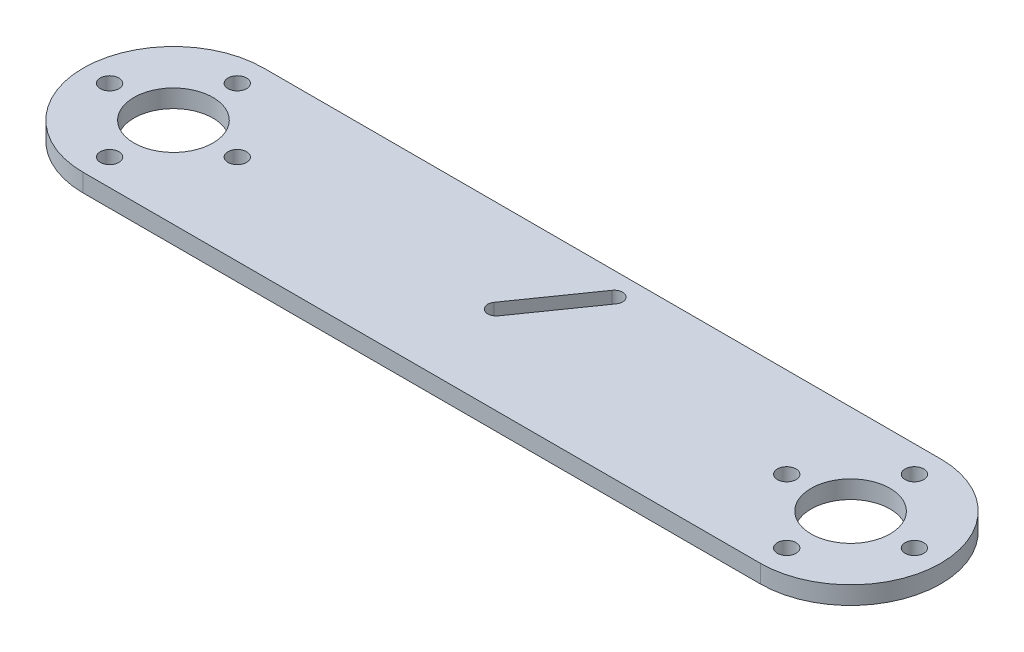
ISO-10303-21;
HEADER;
FILE_DESCRIPTION(('STEP AP214'),'2;1');
FILE_NAME('part.step','',(''),(''),'','','');
FILE_SCHEMA(('AUTOMOTIVE_DESIGN { 1 0 10303 214 1 1 1 1 }'));
ENDSEC;
DATA;
#1=APPLICATION_CONTEXT('core data for automotive mechanical design processes');
#2=APPLICATION_PROTOCOL_DEFINITION('international standard','automotive_design',2000,#1);
#3=PRODUCT_CONTEXT('',#1,'mechanical');
#4=PRODUCT('Part','Part','',(#3));
#5=PRODUCT_RELATED_PRODUCT_CATEGORY('part','',(#4));
#6=PRODUCT_DEFINITION_FORMATION('','',#4);
#7=PRODUCT_DEFINITION_CONTEXT('part definition',#1,'design');
#8=PRODUCT_DEFINITION('design','',#6,#7);
#9=PRODUCT_DEFINITION_SHAPE('','',#8);
#10=(LENGTH_UNIT() NAMED_UNIT(*) SI_UNIT(.MILLI.,.METRE.));
#11=(NAMED_UNIT(*) PLANE_ANGLE_UNIT() SI_UNIT($,.RADIAN.));
#12=(NAMED_UNIT(*) SI_UNIT($,.STERADIAN.) SOLID_ANGLE_UNIT());
#13=UNCERTAINTY_MEASURE_WITH_UNIT(LENGTH_MEASURE(1.E-05),#10,'distance_accuracy_value','');
#14=(GEOMETRIC_REPRESENTATION_CONTEXT(3) GLOBAL_UNCERTAINTY_ASSIGNED_CONTEXT((#13)) GLOBAL_UNIT_ASSIGNED_CONTEXT((#10,
#11,#12)) REPRESENTATION_CONTEXT('',''));
#15=CARTESIAN_POINT('',(0.,0.,0.));
#16=DIRECTION('',(0.,0.,1.));
#17=DIRECTION('',(1.,0.,0.));
#18=AXIS2_PLACEMENT_3D('',#15,#16,#17);
#19=CARTESIAN_POINT('',(0.,3.175,0.));
#20=DIRECTION('',(0.,1.,0.));
#21=DIRECTION('',(0.,0.,1.));
#22=AXIS2_PLACEMENT_3D('',#19,#20,#21);
#23=PLANE('',#22);
#24=CARTESIAN_POINT('',(131.313708498985,3.175,-16.));
#25=DIRECTION('',(0.,1.,0.));
#26=DIRECTION('',(0.,0.,1.));
#27=AXIS2_PLACEMENT_3D('',#24,#25,#26);
#28=CIRCLE('',#27,1.64999999999999);
#29=CARTESIAN_POINT('',(131.313708498985,3.175,-14.35));
#30=VERTEX_POINT('',#29);
#31=EDGE_CURVE('E320',#30,#30,#28,.F.);
#32=ORIENTED_EDGE('',*,*,#31,.T.);
#33=EDGE_LOOP('',(#32));
#34=FACE_BOUND('',#33,.T.);
#35=CARTESIAN_POINT('',(120.,3.175,-4.68629150101524));
#36=DIRECTION('',(0.,1.,0.));
#37=DIRECTION('',(0.,0.,1.));
#38=AXIS2_PLACEMENT_3D('',#35,#36,#37);
#39=CIRCLE('',#38,1.64999999999999);
#40=CARTESIAN_POINT('',(120.,3.175,-3.03629150101525));
#41=VERTEX_POINT('',#40);
#42=EDGE_CURVE('E316',#41,#41,#39,.F.);
#43=ORIENTED_EDGE('',*,*,#42,.T.);
#44=EDGE_LOOP('',(#43));
#45=FACE_BOUND('',#44,.T.);
#46=CARTESIAN_POINT('',(108.686291501015,3.175,-16.));
#47=DIRECTION('',(0.,1.,0.));
#48=DIRECTION('',(0.,0.,1.));
#49=AXIS2_PLACEMENT_3D('',#46,#47,#48);
#50=CIRCLE('',#49,1.64999999999999);
#51=CARTESIAN_POINT('',(108.686291501015,3.175,-14.35));
#52=VERTEX_POINT('',#51);
#53=EDGE_CURVE('E315',#52,#52,#50,.F.);
#54=ORIENTED_EDGE('',*,*,#53,.T.);
#55=EDGE_LOOP('',(#54));
#56=FACE_BOUND('',#55,.T.);
#57=CARTESIAN_POINT('',(120.,3.175,-27.3137084989848));
#58=DIRECTION('',(0.,1.,0.));
#59=DIRECTION('',(0.,0.,1.));
#60=AXIS2_PLACEMENT_3D('',#57,#58,#59);
#61=CIRCLE('',#60,1.64999999999999);
#62=CARTESIAN_POINT('',(120.,3.175,-25.6637084989848));
#63=VERTEX_POINT('',#62);
#64=EDGE_CURVE('E194',#63,#63,#61,.F.);
#65=ORIENTED_EDGE('',*,*,#64,.T.);
#66=EDGE_LOOP('',(#65));
#67=FACE_BOUND('',#66,.T.);
#68=DIRECTION('',(1.,0.,0.));
#69=VECTOR('',#68,1.);
#70=CARTESIAN_POINT('',(0.,3.175,-32.));
#71=LINE('',#70,#69);
#72=CARTESIAN_POINT('',(0.,3.175,-32.));
#73=VERTEX_POINT('',#72);
#74=CARTESIAN_POINT('',(120.,3.175,-32.));
#75=VERTEX_POINT('',#74);
#76=EDGE_CURVE('E180',#73,#75,#71,.T.);
#77=ORIENTED_EDGE('',*,*,#76,.F.);
#78=CARTESIAN_POINT('',(0.,3.175,-16.));
#79=DIRECTION('',(0.,1.,0.));
#80=DIRECTION('',(0.,0.,1.));
#81=AXIS2_PLACEMENT_3D('',#78,#79,#80);
#82=CIRCLE('',#81,16.);
#83=CARTESIAN_POINT('',(0.,3.175,0.));
#84=VERTEX_POINT('',#83);
#85=EDGE_CURVE('E296',#73,#84,#82,.T.);
#86=ORIENTED_EDGE('',*,*,#85,.T.);
#87=DIRECTION('',(1.,0.,0.));
#88=VECTOR('',#87,1.);
#89=CARTESIAN_POINT('',(0.,3.175,0.));
#90=LINE('',#89,#88);
#91=CARTESIAN_POINT('',(120.,3.175,0.));
#92=VERTEX_POINT('',#91);
#93=EDGE_CURVE('E281',#84,#92,#90,.T.);
#94=ORIENTED_EDGE('',*,*,#93,.T.);
#95=CARTESIAN_POINT('',(120.,3.175,-16.));
#96=DIRECTION('',(0.,1.,0.));
#97=DIRECTION('',(0.,0.,1.));
#98=AXIS2_PLACEMENT_3D('',#95,#96,#97);
#99=CIRCLE('',#98,16.);
#100=EDGE_CURVE('E286',#75,#92,#99,.F.);
#101=ORIENTED_EDGE('',*,*,#100,.F.);
#102=EDGE_LOOP('',(#77,#86,#94,#101));
#103=FACE_BOUND('',#102,.T.);
#104=CARTESIAN_POINT('',(120.,3.175,-16.));
#105=DIRECTION('',(0.,1.,0.));
#106=DIRECTION('',(0.,0.,1.));
#107=AXIS2_PLACEMENT_3D('',#104,#105,#106);
#108=CIRCLE('',#107,7.00000000000001);
#109=CARTESIAN_POINT('',(120.,3.175,-8.99999999999999));
#110=VERTEX_POINT('',#109);
#111=EDGE_CURVE('E290',#110,#110,#108,.T.);
#112=ORIENTED_EDGE('',*,*,#111,.F.);
#113=EDGE_LOOP('',(#112));
#114=FACE_BOUND('',#113,.T.);
#115=DIRECTION('',(0.573576436351049,0.,-0.81915204428899));
#116=VECTOR('',#115,1.);
#117=CARTESIAN_POINT('',(30.0818991055639,3.175,21.0635725173799));
#118=LINE('',#117,#116);
#119=CARTESIAN_POINT('',(56.3683176762589,3.175,-16.4773237687468));
#120=VERTEX_POINT('',#119);
#121=CARTESIAN_POINT('',(64.9719642215247,3.175,-28.7646044330816));
#122=VERTEX_POINT('',#121);
#123=EDGE_CURVE('E126',#120,#122,#118,.T.);
#124=ORIENTED_EDGE('',*,*,#123,.T.);
#125=CARTESIAN_POINT('',(66.2006922879582,3.175,-27.9042397785551));
#126=DIRECTION('',(0.,1.,0.));
#127=DIRECTION('',(0.,0.,1.));
#128=AXIS2_PLACEMENT_3D('',#125,#126,#127);
#129=CIRCLE('',#128,1.50000000000002);
#130=CARTESIAN_POINT('',(67.4294203543916,3.175,-27.0438751240285));
#131=VERTEX_POINT('',#130);
#132=EDGE_CURVE('E114',#131,#122,#129,.T.);
#133=ORIENTED_EDGE('',*,*,#132,.F.);
#134=DIRECTION('',(0.573576436351049,0.,-0.81915204428899));
#135=VECTOR('',#134,1.);
#136=CARTESIAN_POINT('',(32.5393552384309,3.175,22.7843018264331));
#137=LINE('',#136,#135);
#138=CARTESIAN_POINT('',(58.8257738091259,3.175,-14.7565944596936));
#139=VERTEX_POINT('',#138);
#140=EDGE_CURVE('E125',#139,#131,#137,.T.);
#141=ORIENTED_EDGE('',*,*,#140,.F.);
#142=CARTESIAN_POINT('',(57.5970457426924,3.175,-15.6169591142202));
#143=DIRECTION('',(0.,1.,0.));
#144=DIRECTION('',(0.,0.,1.));
#145=AXIS2_PLACEMENT_3D('',#142,#143,#144);
#146=CIRCLE('',#145,1.50000000000002);
#147=EDGE_CURVE('E132',#120,#139,#146,.T.);
#148=ORIENTED_EDGE('',*,*,#147,.F.);
#149=EDGE_LOOP('',(#124,#133,#141,#148));
#150=FACE_BOUND('',#149,.T.);
#151=CARTESIAN_POINT('',(0.,3.175,-16.));
#152=DIRECTION('',(0.,1.,0.));
#153=DIRECTION('',(0.,0.,1.));
#154=AXIS2_PLACEMENT_3D('',#151,#152,#153);
#155=CIRCLE('',#154,7.);
#156=CARTESIAN_POINT('',(0.,3.175,-9.));
#157=VERTEX_POINT('',#156);
#158=EDGE_CURVE('E135',#157,#157,#155,.T.);
#159=ORIENTED_EDGE('',*,*,#158,.F.);
#160=EDGE_LOOP('',(#159));
#161=FACE_BOUND('',#160,.T.);
#162=CARTESIAN_POINT('',(0.,3.175,-4.68629150101524));
#163=DIRECTION('',(0.,1.,0.));
#164=DIRECTION('',(0.,0.,1.));
#165=AXIS2_PLACEMENT_3D('',#162,#163,#164);
#166=CIRCLE('',#165,1.65);
#167=CARTESIAN_POINT('',(0.,3.175,-3.03629150101524));
#168=VERTEX_POINT('',#167);
#169=EDGE_CURVE('E329',#168,#168,#166,.T.);
#170=ORIENTED_EDGE('',*,*,#169,.F.);
#171=EDGE_LOOP('',(#170));
#172=FACE_BOUND('',#171,.T.);
#173=CARTESIAN_POINT('',(11.3137084989848,3.175,-16.));
#174=DIRECTION('',(0.,1.,0.));
#175=DIRECTION('',(0.,0.,1.));
#176=AXIS2_PLACEMENT_3D('',#173,#174,#175);
#177=CIRCLE('',#176,1.65);
#178=CARTESIAN_POINT('',(11.3137084989848,3.175,-14.35));
#179=VERTEX_POINT('',#178);
#180=EDGE_CURVE('E334',#179,#179,#177,.T.);
#181=ORIENTED_EDGE('',*,*,#180,.F.);
#182=EDGE_LOOP('',(#181));
#183=FACE_BOUND('',#182,.T.);
#184=CARTESIAN_POINT('',(0.,3.175,-27.3137084989848));
#185=DIRECTION('',(0.,1.,0.));
#186=DIRECTION('',(0.,0.,1.));
#187=AXIS2_PLACEMENT_3D('',#184,#185,#186);
#188=CIRCLE('',#187,1.65);
#189=CARTESIAN_POINT('',(0.,3.175,-25.6637084989848));
#190=VERTEX_POINT('',#189);
#191=EDGE_CURVE('E327',#190,#190,#188,.T.);
#192=ORIENTED_EDGE('',*,*,#191,.F.);
#193=EDGE_LOOP('',(#192));
#194=FACE_BOUND('',#193,.T.);
#195=CARTESIAN_POINT('',(-11.3137084989848,3.175,-16.));
#196=DIRECTION('',(0.,1.,0.));
#197=DIRECTION('',(0.,0.,1.));
#198=AXIS2_PLACEMENT_3D('',#195,#196,#197);
#199=CIRCLE('',#198,1.65);
#200=CARTESIAN_POINT('',(-11.3137084989848,3.175,-14.35));
#201=VERTEX_POINT('',#200);
#202=EDGE_CURVE('E323',#201,#201,#199,.T.);
#203=ORIENTED_EDGE('',*,*,#202,.F.);
#204=EDGE_LOOP('',(#203));
#205=FACE_BOUND('',#204,.T.);
#206=ADVANCED_FACE('F39',(#34,#45,#56,#67,#103,#114,#150,#161,#172,#183,#194,#205),#23,.T.);
#207=CARTESIAN_POINT('',(0.,0.,0.));
#208=DIRECTION('',(0.,1.,0.));
#209=DIRECTION('',(0.,0.,1.));
#210=AXIS2_PLACEMENT_3D('',#207,#208,#209);
#211=PLANE('',#210);
#212=CARTESIAN_POINT('',(0.,0.,-27.3137084989848));
#213=DIRECTION('',(0.,1.,0.));
#214=DIRECTION('',(0.,0.,1.));
#215=AXIS2_PLACEMENT_3D('',#212,#213,#214);
#216=CIRCLE('',#215,1.65);
#217=CARTESIAN_POINT('',(0.,0.,-25.6637084989848));
#218=VERTEX_POINT('',#217);
#219=EDGE_CURVE('E200',#218,#218,#216,.T.);
#220=ORIENTED_EDGE('',*,*,#219,.T.);
#221=EDGE_LOOP('',(#220));
#222=FACE_BOUND('',#221,.T.);
#223=CARTESIAN_POINT('',(0.,0.,-4.68629150101524));
#224=DIRECTION('',(0.,1.,0.));
#225=DIRECTION('',(0.,0.,1.));
#226=AXIS2_PLACEMENT_3D('',#223,#224,#225);
#227=CIRCLE('',#226,1.65);
#228=CARTESIAN_POINT('',(0.,0.,-3.03629150101524));
#229=VERTEX_POINT('',#228);
#230=EDGE_CURVE('E193',#229,#229,#227,.T.);
#231=ORIENTED_EDGE('',*,*,#230,.T.);
#232=EDGE_LOOP('',(#231));
#233=FACE_BOUND('',#232,.T.);
#234=CARTESIAN_POINT('',(120.,0.,-27.3137084989848));
#235=DIRECTION('',(0.,1.,0.));
#236=DIRECTION('',(0.,0.,1.));
#237=AXIS2_PLACEMENT_3D('',#234,#235,#236);
#238=CIRCLE('',#237,1.64999999999999);
#239=CARTESIAN_POINT('',(120.,0.,-25.6637084989848));
#240=VERTEX_POINT('',#239);
#241=EDGE_CURVE('E190',#240,#240,#238,.F.);
#242=ORIENTED_EDGE('',*,*,#241,.F.);
#243=EDGE_LOOP('',(#242));
#244=FACE_BOUND('',#243,.T.);
#245=DIRECTION('',(1.,0.,0.));
#246=VECTOR('',#245,1.);
#247=CARTESIAN_POINT('',(0.,0.,-32.));
#248=LINE('',#247,#246);
#249=CARTESIAN_POINT('',(0.,0.,-32.));
#250=VERTEX_POINT('',#249);
#251=CARTESIAN_POINT('',(120.,0.,-32.));
#252=VERTEX_POINT('',#251);
#253=EDGE_CURVE('E155',#250,#252,#248,.T.);
#254=ORIENTED_EDGE('',*,*,#253,.T.);
#255=CARTESIAN_POINT('',(120.,0.,-16.));
#256=DIRECTION('',(0.,1.,0.));
#257=DIRECTION('',(0.,0.,1.));
#258=AXIS2_PLACEMENT_3D('',#255,#256,#257);
#259=CIRCLE('',#258,16.);
#260=CARTESIAN_POINT('',(120.,0.,0.));
#261=VERTEX_POINT('',#260);
#262=EDGE_CURVE('E163',#252,#261,#259,.F.);
#263=ORIENTED_EDGE('',*,*,#262,.T.);
#264=DIRECTION('',(1.,0.,0.));
#265=VECTOR('',#264,1.);
#266=CARTESIAN_POINT('',(0.,0.,0.));
#267=LINE('',#266,#265);
#268=CARTESIAN_POINT('',(0.,0.,0.));
#269=VERTEX_POINT('',#268);
#270=EDGE_CURVE('E160',#269,#261,#267,.T.);
#271=ORIENTED_EDGE('',*,*,#270,.F.);
#272=CARTESIAN_POINT('',(0.,0.,-16.));
#273=DIRECTION('',(0.,1.,0.));
#274=DIRECTION('',(0.,0.,1.));
#275=AXIS2_PLACEMENT_3D('',#272,#273,#274);
#276=CIRCLE('',#275,16.);
#277=EDGE_CURVE('E158',#250,#269,#276,.T.);
#278=ORIENTED_EDGE('',*,*,#277,.F.);
#279=EDGE_LOOP('',(#254,#263,#271,#278));
#280=FACE_BOUND('',#279,.T.);
#281=CARTESIAN_POINT('',(120.,0.,-16.));
#282=DIRECTION('',(0.,1.,0.));
#283=DIRECTION('',(0.,0.,1.));
#284=AXIS2_PLACEMENT_3D('',#281,#282,#283);
#285=CIRCLE('',#284,7.00000000000001);
#286=CARTESIAN_POINT('',(120.,0.,-8.99999999999999));
#287=VERTEX_POINT('',#286);
#288=EDGE_CURVE('E166',#287,#287,#285,.T.);
#289=ORIENTED_EDGE('',*,*,#288,.T.);
#290=EDGE_LOOP('',(#289));
#291=FACE_BOUND('',#290,.T.);
#292=DIRECTION('',(0.573576436351049,0.,-0.81915204428899));
#293=VECTOR('',#292,1.);
#294=CARTESIAN_POINT('',(30.0818991055639,0.,21.0635725173799));
#295=LINE('',#294,#293);
#296=CARTESIAN_POINT('',(56.3683176762589,0.,-16.4773237687468));
#297=VERTEX_POINT('',#296);
#298=CARTESIAN_POINT('',(64.9719642215247,0.,-28.7646044330816));
#299=VERTEX_POINT('',#298);
#300=EDGE_CURVE('E169',#297,#299,#295,.T.);
#301=ORIENTED_EDGE('',*,*,#300,.F.);
#302=CARTESIAN_POINT('',(57.5970457426924,0.,-15.6169591142202));
#303=DIRECTION('',(0.,1.,0.));
#304=DIRECTION('',(0.,0.,1.));
#305=AXIS2_PLACEMENT_3D('',#302,#303,#304);
#306=CIRCLE('',#305,1.50000000000002);
#307=CARTESIAN_POINT('',(58.8257738091259,0.,-14.7565944596936));
#308=VERTEX_POINT('',#307);
#309=EDGE_CURVE('E174',#297,#308,#306,.T.);
#310=ORIENTED_EDGE('',*,*,#309,.T.);
#311=DIRECTION('',(0.573576436351049,0.,-0.81915204428899));
#312=VECTOR('',#311,1.);
#313=CARTESIAN_POINT('',(32.5393552384309,0.,22.7843018264331));
#314=LINE('',#313,#312);
#315=CARTESIAN_POINT('',(67.4294203543916,0.,-27.0438751240285));
#316=VERTEX_POINT('',#315);
#317=EDGE_CURVE('E172',#308,#316,#314,.T.);
#318=ORIENTED_EDGE('',*,*,#317,.T.);
#319=CARTESIAN_POINT('',(66.2006922879582,0.,-27.9042397785551));
#320=DIRECTION('',(0.,1.,0.));
#321=DIRECTION('',(0.,0.,1.));
#322=AXIS2_PLACEMENT_3D('',#319,#320,#321);
#323=CIRCLE('',#322,1.50000000000002);
#324=EDGE_CURVE('E116',#316,#299,#323,.T.);
#325=ORIENTED_EDGE('',*,*,#324,.T.);
#326=EDGE_LOOP('',(#301,#310,#318,#325));
#327=FACE_BOUND('',#326,.T.);
#328=CARTESIAN_POINT('',(0.,0.,-16.));
#329=DIRECTION('',(0.,1.,0.));
#330=DIRECTION('',(0.,0.,1.));
#331=AXIS2_PLACEMENT_3D('',#328,#329,#330);
#332=CIRCLE('',#331,7.);
#333=CARTESIAN_POINT('',(0.,0.,-9.));
#334=VERTEX_POINT('',#333);
#335=EDGE_CURVE('E177',#334,#334,#332,.T.);
#336=ORIENTED_EDGE('',*,*,#335,.T.);
#337=EDGE_LOOP('',(#336));
#338=FACE_BOUND('',#337,.T.);
#339=CARTESIAN_POINT('',(11.3137084989848,0.,-16.));
#340=DIRECTION('',(0.,1.,0.));
#341=DIRECTION('',(0.,0.,1.));
#342=AXIS2_PLACEMENT_3D('',#339,#340,#341);
#343=CIRCLE('',#342,1.65);
#344=CARTESIAN_POINT('',(11.3137084989848,0.,-14.35));
#345=VERTEX_POINT('',#344);
#346=EDGE_CURVE('E197',#345,#345,#343,.T.);
#347=ORIENTED_EDGE('',*,*,#346,.T.);
#348=EDGE_LOOP('',(#347));
#349=FACE_BOUND('',#348,.T.);
#350=CARTESIAN_POINT('',(108.686291501015,0.,-16.));
#351=DIRECTION('',(0.,1.,0.));
#352=DIRECTION('',(0.,0.,1.));
#353=AXIS2_PLACEMENT_3D('',#350,#351,#352);
#354=CIRCLE('',#353,1.64999999999999);
#355=CARTESIAN_POINT('',(108.686291501015,0.,-14.35));
#356=VERTEX_POINT('',#355);
#357=EDGE_CURVE('E203',#356,#356,#354,.F.);
#358=ORIENTED_EDGE('',*,*,#357,.F.);
#359=EDGE_LOOP('',(#358));
#360=FACE_BOUND('',#359,.T.);
#361=CARTESIAN_POINT('',(120.,0.,-4.68629150101524));
#362=DIRECTION('',(0.,1.,0.));
#363=DIRECTION('',(0.,0.,1.));
#364=AXIS2_PLACEMENT_3D('',#361,#362,#363);
#365=CIRCLE('',#364,1.64999999999999);
#366=CARTESIAN_POINT('',(120.,0.,-3.03629150101525));
#367=VERTEX_POINT('',#366);
#368=EDGE_CURVE('E206',#367,#367,#365,.F.);
#369=ORIENTED_EDGE('',*,*,#368,.F.);
#370=EDGE_LOOP('',(#369));
#371=FACE_BOUND('',#370,.T.);
#372=CARTESIAN_POINT('',(131.313708498985,0.,-16.));
#373=DIRECTION('',(0.,1.,0.));
#374=DIRECTION('',(0.,0.,1.));
#375=AXIS2_PLACEMENT_3D('',#372,#373,#374);
#376=CIRCLE('',#375,1.64999999999999);
#377=CARTESIAN_POINT('',(131.313708498985,0.,-14.35));
#378=VERTEX_POINT('',#377);
#379=EDGE_CURVE('E208',#378,#378,#376,.F.);
#380=ORIENTED_EDGE('',*,*,#379,.F.);
#381=EDGE_LOOP('',(#380));
#382=FACE_BOUND('',#381,.T.);
#383=CARTESIAN_POINT('',(-11.3137084989848,0.,-16.));
#384=DIRECTION('',(0.,1.,0.));
#385=DIRECTION('',(0.,0.,1.));
#386=AXIS2_PLACEMENT_3D('',#383,#384,#385);
#387=CIRCLE('',#386,1.65);
#388=CARTESIAN_POINT('',(-11.3137084989848,0.,-14.35));
#389=VERTEX_POINT('',#388);
#390=EDGE_CURVE('E43',#389,#389,#387,.T.);
#391=ORIENTED_EDGE('',*,*,#390,.T.);
#392=EDGE_LOOP('',(#391));
#393=FACE_BOUND('',#392,.T.);
#394=ADVANCED_FACE('F215',(#222,#233,#244,#280,#291,#327,#338,#349,#360,#371,#382,#393),#211,.F.);
#395=CARTESIAN_POINT('',(30.0818991055639,3.175,21.0635725173799));
#396=DIRECTION('',(-0.81915204428899,0.,-0.573576436351049));
#397=DIRECTION('',(-0.573576436351049,0.,0.81915204428899));
#398=AXIS2_PLACEMENT_3D('',#395,#396,#397);
#399=PLANE('',#398);
#400=ORIENTED_EDGE('',*,*,#300,.T.);
#401=DIRECTION('',(0.,-1.,0.));
#402=VECTOR('',#401,1.);
#403=CARTESIAN_POINT('',(64.9719642215247,3.175,-28.7646044330816));
#404=LINE('',#403,#402);
#405=EDGE_CURVE('E12',#122,#299,#404,.T.);
#406=ORIENTED_EDGE('',*,*,#405,.F.);
#407=ORIENTED_EDGE('',*,*,#123,.F.);
#408=DIRECTION('',(0.,-1.,0.));
#409=VECTOR('',#408,1.);
#410=CARTESIAN_POINT('',(56.3683176762589,3.175,-16.4773237687468));
#411=LINE('',#410,#409);
#412=EDGE_CURVE('E58',#120,#297,#411,.T.);
#413=ORIENTED_EDGE('',*,*,#412,.T.);
#414=EDGE_LOOP('',(#400,#406,#407,#413));
#415=FACE_BOUND('',#414,.T.);
#416=ADVANCED_FACE('F236',(#415),#399,.F.);
#417=CARTESIAN_POINT('',(66.2006922879582,3.175,-27.9042397785551));
#418=DIRECTION('',(0.,-1.,0.));
#419=DIRECTION('',(0.,0.,-1.));
#420=AXIS2_PLACEMENT_3D('',#417,#418,#419);
#421=CYLINDRICAL_SURFACE('',#420,1.50000000000002);
#422=ORIENTED_EDGE('',*,*,#324,.F.);
#423=DIRECTION('',(0.,-1.,0.));
#424=VECTOR('',#423,1.);
#425=CARTESIAN_POINT('',(67.4294203543916,3.175,-27.0438751240285));
#426=LINE('',#425,#424);
#427=EDGE_CURVE('E49',#131,#316,#426,.T.);
#428=ORIENTED_EDGE('',*,*,#427,.F.);
#429=ORIENTED_EDGE('',*,*,#132,.T.);
#430=ORIENTED_EDGE('',*,*,#405,.T.);
#431=EDGE_LOOP('',(#422,#428,#429,#430));
#432=FACE_BOUND('',#431,.T.);
#433=ADVANCED_FACE('F113',(#432),#421,.F.);
#434=CARTESIAN_POINT('',(32.5393552384309,3.175,22.7843018264331));
#435=DIRECTION('',(-0.81915204428899,0.,-0.573576436351049));
#436=DIRECTION('',(-0.573576436351049,0.,0.81915204428899));
#437=AXIS2_PLACEMENT_3D('',#434,#435,#436);
#438=PLANE('',#437);
#439=ORIENTED_EDGE('',*,*,#317,.F.);
#440=DIRECTION('',(0.,-1.,0.));
#441=VECTOR('',#440,1.);
#442=CARTESIAN_POINT('',(58.8257738091259,3.175,-14.7565944596936));
#443=LINE('',#442,#441);
#444=EDGE_CURVE('E83',#139,#308,#443,.T.);
#445=ORIENTED_EDGE('',*,*,#444,.F.);
#446=ORIENTED_EDGE('',*,*,#140,.T.);
#447=ORIENTED_EDGE('',*,*,#427,.T.);
#448=EDGE_LOOP('',(#439,#445,#446,#447));
#449=FACE_BOUND('',#448,.T.);
#450=ADVANCED_FACE('F130',(#449),#438,.T.);
#451=CARTESIAN_POINT('',(0.,3.175,-32.));
#452=DIRECTION('',(0.,0.,-1.));
#453=DIRECTION('',(-1.,0.,0.));
#454=AXIS2_PLACEMENT_3D('',#451,#452,#453);
#455=PLANE('',#454);
#456=ORIENTED_EDGE('',*,*,#253,.F.);
#457=DIRECTION('',(0.,-1.,0.));
#458=VECTOR('',#457,1.);
#459=CARTESIAN_POINT('',(0.,3.175,-32.));
#460=LINE('',#459,#458);
#461=EDGE_CURVE('E95',#73,#250,#460,.T.);
#462=ORIENTED_EDGE('',*,*,#461,.F.);
#463=ORIENTED_EDGE('',*,*,#76,.T.);
#464=DIRECTION('',(0.,-1.,0.));
#465=VECTOR('',#464,1.);
#466=CARTESIAN_POINT('',(120.,3.175,-32.));
#467=LINE('',#466,#465);
#468=EDGE_CURVE('E154',#75,#252,#467,.T.);
#469=ORIENTED_EDGE('',*,*,#468,.T.);
#470=EDGE_LOOP('',(#456,#462,#463,#469));
#471=FACE_BOUND('',#470,.T.);
#472=ADVANCED_FACE('F41',(#471),#455,.T.);
#473=CARTESIAN_POINT('',(0.,3.175,-16.));
#474=DIRECTION('',(0.,-1.,0.));
#475=DIRECTION('',(0.,0.,-1.));
#476=AXIS2_PLACEMENT_3D('',#473,#474,#475);
#477=CYLINDRICAL_SURFACE('',#476,16.);
#478=ORIENTED_EDGE('',*,*,#277,.T.);
#479=DIRECTION('',(0.,-1.,0.));
#480=VECTOR('',#479,1.);
#481=CARTESIAN_POINT('',(0.,3.175,0.));
#482=LINE('',#481,#480);
#483=EDGE_CURVE('E186',#84,#269,#482,.T.);
#484=ORIENTED_EDGE('',*,*,#483,.F.);
#485=ORIENTED_EDGE('',*,*,#85,.F.);
#486=ORIENTED_EDGE('',*,*,#461,.T.);
#487=EDGE_LOOP('',(#478,#484,#485,#486));
#488=FACE_BOUND('',#487,.T.);
#489=ADVANCED_FACE('F268',(#488),#477,.T.);
#490=CARTESIAN_POINT('',(0.,3.175,0.));
#491=DIRECTION('',(0.,0.,-1.));
#492=DIRECTION('',(-1.,0.,0.));
#493=AXIS2_PLACEMENT_3D('',#490,#491,#492);
#494=PLANE('',#493);
#495=ORIENTED_EDGE('',*,*,#270,.T.);
#496=DIRECTION('',(0.,-1.,0.));
#497=VECTOR('',#496,1.);
#498=CARTESIAN_POINT('',(120.,3.175,0.));
#499=LINE('',#498,#497);
#500=EDGE_CURVE('E184',#92,#261,#499,.T.);
#501=ORIENTED_EDGE('',*,*,#500,.F.);
#502=ORIENTED_EDGE('',*,*,#93,.F.);
#503=ORIENTED_EDGE('',*,*,#483,.T.);
#504=EDGE_LOOP('',(#495,#501,#502,#503));
#505=FACE_BOUND('',#504,.T.);
#506=ADVANCED_FACE('F254',(#505),#494,.F.);
#507=CARTESIAN_POINT('',(57.5970457426924,3.175,-15.6169591142202));
#508=DIRECTION('',(0.,-1.,0.));
#509=DIRECTION('',(0.,0.,-1.));
#510=AXIS2_PLACEMENT_3D('',#507,#508,#509);
#511=CYLINDRICAL_SURFACE('',#510,1.50000000000002);
#512=ORIENTED_EDGE('',*,*,#309,.F.);
#513=ORIENTED_EDGE('',*,*,#412,.F.);
#514=ORIENTED_EDGE('',*,*,#147,.T.);
#515=ORIENTED_EDGE('',*,*,#444,.T.);
#516=EDGE_LOOP('',(#512,#513,#514,#515));
#517=FACE_BOUND('',#516,.T.);
#518=ADVANCED_FACE('F250',(#517),#511,.F.);
#519=CARTESIAN_POINT('',(120.,3.175,-16.));
#520=DIRECTION('',(0.,-1.,0.));
#521=DIRECTION('',(0.,0.,-1.));
#522=AXIS2_PLACEMENT_3D('',#519,#520,#521);
#523=CYLINDRICAL_SURFACE('',#522,7.00000000000001);
#524=ORIENTED_EDGE('',*,*,#111,.T.);
#525=EDGE_LOOP('',(#524));
#526=FACE_BOUND('',#525,.T.);
#527=ORIENTED_EDGE('',*,*,#288,.F.);
#528=EDGE_LOOP('',(#527));
#529=FACE_BOUND('',#528,.T.);
#530=ADVANCED_FACE('F253',(#526,#529),#523,.F.);
#531=CARTESIAN_POINT('',(120.,3.175,-16.));
#532=DIRECTION('',(0.,-1.,0.));
#533=DIRECTION('',(0.,0.,-1.));
#534=AXIS2_PLACEMENT_3D('',#531,#532,#533);
#535=CYLINDRICAL_SURFACE('',#534,16.);
#536=ORIENTED_EDGE('',*,*,#262,.F.);
#537=ORIENTED_EDGE('',*,*,#468,.F.);
#538=ORIENTED_EDGE('',*,*,#100,.T.);
#539=ORIENTED_EDGE('',*,*,#500,.T.);
#540=EDGE_LOOP('',(#536,#537,#538,#539));
#541=FACE_BOUND('',#540,.T.);
#542=ADVANCED_FACE('F248',(#541),#535,.T.);
#543=CARTESIAN_POINT('',(0.,3.175,-16.));
#544=DIRECTION('',(0.,-1.,0.));
#545=DIRECTION('',(0.,0.,-1.));
#546=AXIS2_PLACEMENT_3D('',#543,#544,#545);
#547=CYLINDRICAL_SURFACE('',#546,7.);
#548=ORIENTED_EDGE('',*,*,#158,.T.);
#549=EDGE_LOOP('',(#548));
#550=FACE_BOUND('',#549,.T.);
#551=ORIENTED_EDGE('',*,*,#335,.F.);
#552=EDGE_LOOP('',(#551));
#553=FACE_BOUND('',#552,.T.);
#554=ADVANCED_FACE('F245',(#550,#553),#547,.F.);
#555=CARTESIAN_POINT('',(120.,-6.825,-27.3137084989848));
#556=DIRECTION('',(0.,1.,0.));
#557=DIRECTION('',(0.,0.,1.));
#558=AXIS2_PLACEMENT_3D('',#555,#556,#557);
#559=CYLINDRICAL_SURFACE('',#558,1.64999999999999);
#560=ORIENTED_EDGE('',*,*,#64,.F.);
#561=EDGE_LOOP('',(#560));
#562=FACE_BOUND('',#561,.T.);
#563=ORIENTED_EDGE('',*,*,#241,.T.);
#564=EDGE_LOOP('',(#563));
#565=FACE_BOUND('',#564,.T.);
#566=ADVANCED_FACE('F242',(#562,#565),#559,.F.);
#567=CARTESIAN_POINT('',(0.,-6.825,-4.68629150101524));
#568=DIRECTION('',(0.,1.,0.));
#569=DIRECTION('',(0.,0.,1.));
#570=AXIS2_PLACEMENT_3D('',#567,#568,#569);
#571=CYLINDRICAL_SURFACE('',#570,1.65);
#572=ORIENTED_EDGE('',*,*,#169,.T.);
#573=EDGE_LOOP('',(#572));
#574=FACE_BOUND('',#573,.T.);
#575=ORIENTED_EDGE('',*,*,#230,.F.);
#576=EDGE_LOOP('',(#575));
#577=FACE_BOUND('',#576,.T.);
#578=ADVANCED_FACE('F360',(#574,#577),#571,.F.);
#579=CARTESIAN_POINT('',(11.3137084989848,-6.825,-16.));
#580=DIRECTION('',(0.,1.,0.));
#581=DIRECTION('',(0.,0.,1.));
#582=AXIS2_PLACEMENT_3D('',#579,#580,#581);
#583=CYLINDRICAL_SURFACE('',#582,1.65);
#584=ORIENTED_EDGE('',*,*,#180,.T.);
#585=EDGE_LOOP('',(#584));
#586=FACE_BOUND('',#585,.T.);
#587=ORIENTED_EDGE('',*,*,#346,.F.);
#588=EDGE_LOOP('',(#587));
#589=FACE_BOUND('',#588,.T.);
#590=ADVANCED_FACE('F351',(#586,#589),#583,.F.);
#591=CARTESIAN_POINT('',(0.,-6.825,-27.3137084989848));
#592=DIRECTION('',(0.,1.,0.));
#593=DIRECTION('',(0.,0.,1.));
#594=AXIS2_PLACEMENT_3D('',#591,#592,#593);
#595=CYLINDRICAL_SURFACE('',#594,1.65);
#596=ORIENTED_EDGE('',*,*,#191,.T.);
#597=EDGE_LOOP('',(#596));
#598=FACE_BOUND('',#597,.T.);
#599=ORIENTED_EDGE('',*,*,#219,.F.);
#600=EDGE_LOOP('',(#599));
#601=FACE_BOUND('',#600,.T.);
#602=ADVANCED_FACE('F344',(#598,#601),#595,.F.);
#603=CARTESIAN_POINT('',(108.686291501015,-6.825,-16.));
#604=DIRECTION('',(0.,1.,0.));
#605=DIRECTION('',(0.,0.,1.));
#606=AXIS2_PLACEMENT_3D('',#603,#604,#605);
#607=CYLINDRICAL_SURFACE('',#606,1.64999999999999);
#608=ORIENTED_EDGE('',*,*,#53,.F.);
#609=EDGE_LOOP('',(#608));
#610=FACE_BOUND('',#609,.T.);
#611=ORIENTED_EDGE('',*,*,#357,.T.);
#612=EDGE_LOOP('',(#611));
#613=FACE_BOUND('',#612,.T.);
#614=ADVANCED_FACE('F350',(#610,#613),#607,.F.);
#615=CARTESIAN_POINT('',(120.,-6.825,-4.68629150101524));
#616=DIRECTION('',(0.,1.,0.));
#617=DIRECTION('',(0.,0.,1.));
#618=AXIS2_PLACEMENT_3D('',#615,#616,#617);
#619=CYLINDRICAL_SURFACE('',#618,1.64999999999999);
#620=ORIENTED_EDGE('',*,*,#42,.F.);
#621=EDGE_LOOP('',(#620));
#622=FACE_BOUND('',#621,.T.);
#623=ORIENTED_EDGE('',*,*,#368,.T.);
#624=EDGE_LOOP('',(#623));
#625=FACE_BOUND('',#624,.T.);
#626=ADVANCED_FACE('F225',(#622,#625),#619,.F.);
#627=CARTESIAN_POINT('',(131.313708498985,-6.825,-16.));
#628=DIRECTION('',(0.,1.,0.));
#629=DIRECTION('',(0.,0.,1.));
#630=AXIS2_PLACEMENT_3D('',#627,#628,#629);
#631=CYLINDRICAL_SURFACE('',#630,1.64999999999999);
#632=ORIENTED_EDGE('',*,*,#31,.F.);
#633=EDGE_LOOP('',(#632));
#634=FACE_BOUND('',#633,.T.);
#635=ORIENTED_EDGE('',*,*,#379,.T.);
#636=EDGE_LOOP('',(#635));
#637=FACE_BOUND('',#636,.T.);
#638=ADVANCED_FACE('F219',(#634,#637),#631,.F.);
#639=CARTESIAN_POINT('',(-11.3137084989848,-6.825,-16.));
#640=DIRECTION('',(0.,1.,0.));
#641=DIRECTION('',(0.,0.,1.));
#642=AXIS2_PLACEMENT_3D('',#639,#640,#641);
#643=CYLINDRICAL_SURFACE('',#642,1.65);
#644=ORIENTED_EDGE('',*,*,#202,.T.);
#645=EDGE_LOOP('',(#644));
#646=FACE_BOUND('',#645,.T.);
#647=ORIENTED_EDGE('',*,*,#390,.F.);
#648=EDGE_LOOP('',(#647));
#649=FACE_BOUND('',#648,.T.);
#650=ADVANCED_FACE('F217',(#646,#649),#643,.F.);
#651=CLOSED_SHELL('',(#206,#394,#416,#433,#450,#472,#489,#506,#518,#530,#542,#554,#566,#578,
#590,#602,#614,#626,#638,#650));
#652=MANIFOLD_SOLID_BREP('B2',#651);
#653=ADVANCED_BREP_SHAPE_REPRESENTATION('',(#18,#652),#14);
#654=SHAPE_DEFINITION_REPRESENTATION(#9,#653);
ENDSEC;
END-ISO-10303-21;
